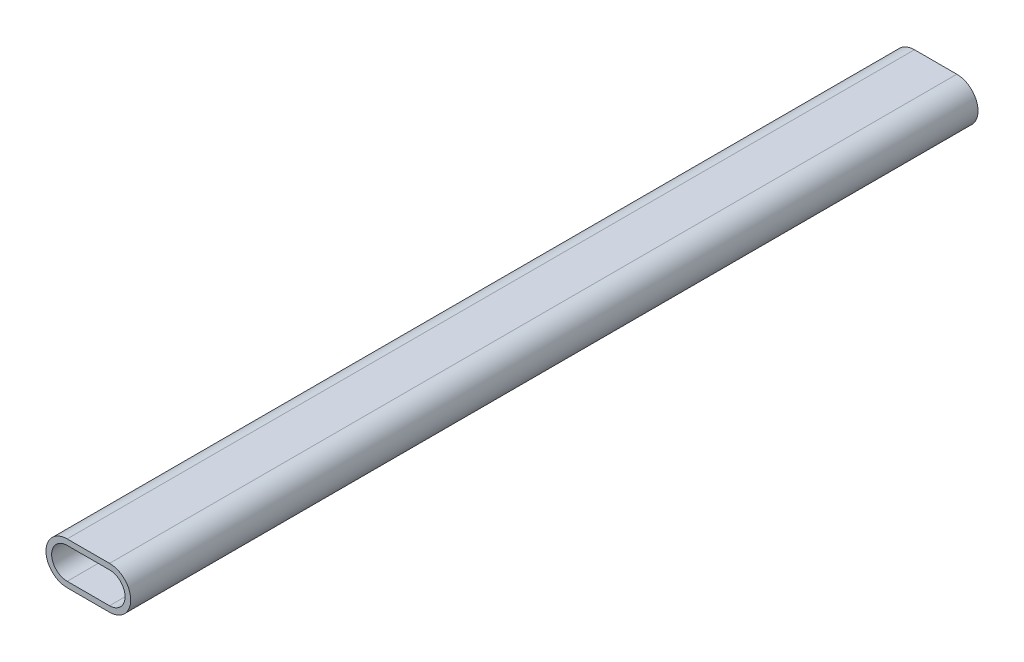
ISO-10303-21;
HEADER;
FILE_DESCRIPTION(('STEP AP214'),'2;1');
FILE_NAME('part.step','',(''),(''),'','','');
FILE_SCHEMA(('AUTOMOTIVE_DESIGN { 1 0 10303 214 1 1 1 1 }'));
ENDSEC;
DATA;
#1=APPLICATION_CONTEXT('core data for automotive mechanical design processes');
#2=APPLICATION_PROTOCOL_DEFINITION('international standard','automotive_design',2000,#1);
#3=PRODUCT_CONTEXT('',#1,'mechanical');
#4=PRODUCT('Part','Part','',(#3));
#5=PRODUCT_RELATED_PRODUCT_CATEGORY('part','',(#4));
#6=PRODUCT_DEFINITION_FORMATION('','',#4);
#7=PRODUCT_DEFINITION_CONTEXT('part definition',#1,'design');
#8=PRODUCT_DEFINITION('design','',#6,#7);
#9=PRODUCT_DEFINITION_SHAPE('','',#8);
#10=(LENGTH_UNIT() NAMED_UNIT(*) SI_UNIT(.MILLI.,.METRE.));
#11=(NAMED_UNIT(*) PLANE_ANGLE_UNIT() SI_UNIT($,.RADIAN.));
#12=(NAMED_UNIT(*) SI_UNIT($,.STERADIAN.) SOLID_ANGLE_UNIT());
#13=UNCERTAINTY_MEASURE_WITH_UNIT(LENGTH_MEASURE(1.E-05),#10,'distance_accuracy_value','');
#14=(GEOMETRIC_REPRESENTATION_CONTEXT(3) GLOBAL_UNCERTAINTY_ASSIGNED_CONTEXT((#13)) GLOBAL_UNIT_ASSIGNED_CONTEXT((#10,
#11,#12)) REPRESENTATION_CONTEXT('',''));
#15=CARTESIAN_POINT('',(0.,0.,0.));
#16=DIRECTION('',(0.,0.,1.));
#17=DIRECTION('',(1.,0.,0.));
#18=AXIS2_PLACEMENT_3D('',#15,#16,#17);
#19=CARTESIAN_POINT('',(-7.5,0.,300.));
#20=DIRECTION('',(0.,0.,1.));
#21=DIRECTION('',(1.,0.,0.));
#22=AXIS2_PLACEMENT_3D('',#19,#20,#21);
#23=PLANE('',#22);
#24=CARTESIAN_POINT('',(-7.5,0.,300.));
#25=DIRECTION('',(0.,0.,1.));
#26=DIRECTION('',(1.,0.,0.));
#27=AXIS2_PLACEMENT_3D('',#24,#25,#26);
#28=CIRCLE('',#27,7.5);
#29=CARTESIAN_POINT('',(-7.5,7.5,300.));
#30=VERTEX_POINT('',#29);
#31=CARTESIAN_POINT('',(-7.5,-7.5,300.));
#32=VERTEX_POINT('',#31);
#33=EDGE_CURVE('E137',#30,#32,#28,.T.);
#34=ORIENTED_EDGE('',*,*,#33,.T.);
#35=DIRECTION('',(1.,0.,0.));
#36=VECTOR('',#35,1.);
#37=CARTESIAN_POINT('',(-7.5,-7.5,300.));
#38=LINE('',#37,#36);
#39=CARTESIAN_POINT('',(7.5,-7.5,300.));
#40=VERTEX_POINT('',#39);
#41=EDGE_CURVE('E140',#32,#40,#38,.T.);
#42=ORIENTED_EDGE('',*,*,#41,.T.);
#43=CARTESIAN_POINT('',(7.5,0.,300.));
#44=DIRECTION('',(0.,0.,1.));
#45=DIRECTION('',(1.,0.,0.));
#46=AXIS2_PLACEMENT_3D('',#43,#44,#45);
#47=CIRCLE('',#46,7.5);
#48=CARTESIAN_POINT('',(7.5,7.5,300.));
#49=VERTEX_POINT('',#48);
#50=EDGE_CURVE('E143',#40,#49,#47,.T.);
#51=ORIENTED_EDGE('',*,*,#50,.T.);
#52=DIRECTION('',(-1.,0.,0.));
#53=VECTOR('',#52,1.);
#54=CARTESIAN_POINT('',(-7.5,7.5,300.));
#55=LINE('',#54,#53);
#56=EDGE_CURVE('E145',#49,#30,#55,.T.);
#57=ORIENTED_EDGE('',*,*,#56,.T.);
#58=EDGE_LOOP('',(#34,#42,#51,#57));
#59=FACE_BOUND('',#58,.T.);
#60=DIRECTION('',(1.,0.,0.));
#61=VECTOR('',#60,1.);
#62=CARTESIAN_POINT('',(-7.5,-5.5,300.));
#63=LINE('',#62,#61);
#64=CARTESIAN_POINT('',(-7.5,-5.5,300.));
#65=VERTEX_POINT('',#64);
#66=CARTESIAN_POINT('',(7.5,-5.5,300.));
#67=VERTEX_POINT('',#66);
#68=EDGE_CURVE('E109',#65,#67,#63,.T.);
#69=ORIENTED_EDGE('',*,*,#68,.F.);
#70=CARTESIAN_POINT('',(-7.5,0.,300.));
#71=DIRECTION('',(0.,0.,1.));
#72=DIRECTION('',(1.,0.,0.));
#73=AXIS2_PLACEMENT_3D('',#70,#71,#72);
#74=CIRCLE('',#73,5.5);
#75=CARTESIAN_POINT('',(-7.5,5.5,300.));
#76=VERTEX_POINT('',#75);
#77=EDGE_CURVE('E101',#76,#65,#74,.T.);
#78=ORIENTED_EDGE('',*,*,#77,.F.);
#79=DIRECTION('',(-1.,0.,0.));
#80=VECTOR('',#79,1.);
#81=CARTESIAN_POINT('',(-7.5,5.5,300.));
#82=LINE('',#81,#80);
#83=CARTESIAN_POINT('',(7.5,5.5,300.));
#84=VERTEX_POINT('',#83);
#85=EDGE_CURVE('E123',#84,#76,#82,.T.);
#86=ORIENTED_EDGE('',*,*,#85,.F.);
#87=CARTESIAN_POINT('',(7.5,0.,300.));
#88=DIRECTION('',(0.,0.,1.));
#89=DIRECTION('',(1.,0.,0.));
#90=AXIS2_PLACEMENT_3D('',#87,#88,#89);
#91=CIRCLE('',#90,5.5);
#92=EDGE_CURVE('E121',#67,#84,#91,.T.);
#93=ORIENTED_EDGE('',*,*,#92,.F.);
#94=EDGE_LOOP('',(#69,#78,#86,#93));
#95=FACE_BOUND('',#94,.T.);
#96=ADVANCED_FACE('F36',(#59,#95),#23,.T.);
#97=CARTESIAN_POINT('',(-7.5,0.,0.));
#98=DIRECTION('',(0.,0.,1.));
#99=DIRECTION('',(1.,0.,0.));
#100=AXIS2_PLACEMENT_3D('',#97,#98,#99);
#101=PLANE('',#100);
#102=CARTESIAN_POINT('',(-7.5,0.,0.));
#103=DIRECTION('',(0.,0.,1.));
#104=DIRECTION('',(1.,0.,0.));
#105=AXIS2_PLACEMENT_3D('',#102,#103,#104);
#106=CIRCLE('',#105,7.5);
#107=CARTESIAN_POINT('',(-7.5,7.5,0.));
#108=VERTEX_POINT('',#107);
#109=CARTESIAN_POINT('',(-7.5,-7.5,0.));
#110=VERTEX_POINT('',#109);
#111=EDGE_CURVE('E117',#108,#110,#106,.T.);
#112=ORIENTED_EDGE('',*,*,#111,.F.);
#113=DIRECTION('',(-1.,0.,0.));
#114=VECTOR('',#113,1.);
#115=CARTESIAN_POINT('',(-7.5,7.5,0.));
#116=LINE('',#115,#114);
#117=CARTESIAN_POINT('',(7.5,7.5,0.));
#118=VERTEX_POINT('',#117);
#119=EDGE_CURVE('E141',#118,#108,#116,.T.);
#120=ORIENTED_EDGE('',*,*,#119,.F.);
#121=CARTESIAN_POINT('',(7.5,0.,0.));
#122=DIRECTION('',(0.,0.,1.));
#123=DIRECTION('',(1.,0.,0.));
#124=AXIS2_PLACEMENT_3D('',#121,#122,#123);
#125=CIRCLE('',#124,7.5);
#126=CARTESIAN_POINT('',(7.5,-7.5,0.));
#127=VERTEX_POINT('',#126);
#128=EDGE_CURVE('E152',#127,#118,#125,.T.);
#129=ORIENTED_EDGE('',*,*,#128,.F.);
#130=DIRECTION('',(1.,0.,0.));
#131=VECTOR('',#130,1.);
#132=CARTESIAN_POINT('',(-7.5,-7.5,0.));
#133=LINE('',#132,#131);
#134=EDGE_CURVE('E150',#110,#127,#133,.T.);
#135=ORIENTED_EDGE('',*,*,#134,.F.);
#136=EDGE_LOOP('',(#112,#120,#129,#135));
#137=FACE_BOUND('',#136,.T.);
#138=CARTESIAN_POINT('',(-7.5,0.,0.));
#139=DIRECTION('',(0.,0.,1.));
#140=DIRECTION('',(1.,0.,0.));
#141=AXIS2_PLACEMENT_3D('',#138,#139,#140);
#142=CIRCLE('',#141,5.5);
#143=CARTESIAN_POINT('',(-7.5,5.5,0.));
#144=VERTEX_POINT('',#143);
#145=CARTESIAN_POINT('',(-7.5,-5.5,0.));
#146=VERTEX_POINT('',#145);
#147=EDGE_CURVE('E59',#144,#146,#142,.T.);
#148=ORIENTED_EDGE('',*,*,#147,.T.);
#149=DIRECTION('',(1.,0.,0.));
#150=VECTOR('',#149,1.);
#151=CARTESIAN_POINT('',(-7.5,-5.5,0.));
#152=LINE('',#151,#150);
#153=CARTESIAN_POINT('',(7.5,-5.5,0.));
#154=VERTEX_POINT('',#153);
#155=EDGE_CURVE('E116',#146,#154,#152,.T.);
#156=ORIENTED_EDGE('',*,*,#155,.T.);
#157=CARTESIAN_POINT('',(7.5,0.,0.));
#158=DIRECTION('',(0.,0.,1.));
#159=DIRECTION('',(1.,0.,0.));
#160=AXIS2_PLACEMENT_3D('',#157,#158,#159);
#161=CIRCLE('',#160,5.5);
#162=CARTESIAN_POINT('',(7.5,5.5,0.));
#163=VERTEX_POINT('',#162);
#164=EDGE_CURVE('E129',#154,#163,#161,.T.);
#165=ORIENTED_EDGE('',*,*,#164,.T.);
#166=DIRECTION('',(-1.,0.,0.));
#167=VECTOR('',#166,1.);
#168=CARTESIAN_POINT('',(-7.5,5.5,0.));
#169=LINE('',#168,#167);
#170=EDGE_CURVE('E110',#163,#144,#169,.T.);
#171=ORIENTED_EDGE('',*,*,#170,.T.);
#172=EDGE_LOOP('',(#148,#156,#165,#171));
#173=FACE_BOUND('',#172,.T.);
#174=ADVANCED_FACE('F170',(#137,#173),#101,.F.);
#175=CARTESIAN_POINT('',(-7.5,0.,300.));
#176=DIRECTION('',(0.,0.,-1.));
#177=DIRECTION('',(-1.,0.,0.));
#178=AXIS2_PLACEMENT_3D('',#175,#176,#177);
#179=CYLINDRICAL_SURFACE('',#178,7.5);
#180=ORIENTED_EDGE('',*,*,#111,.T.);
#181=DIRECTION('',(0.,0.,-1.));
#182=VECTOR('',#181,1.);
#183=CARTESIAN_POINT('',(-7.5,-7.5,300.));
#184=LINE('',#183,#182);
#185=EDGE_CURVE('E11',#32,#110,#184,.T.);
#186=ORIENTED_EDGE('',*,*,#185,.F.);
#187=ORIENTED_EDGE('',*,*,#33,.F.);
#188=DIRECTION('',(0.,0.,-1.));
#189=VECTOR('',#188,1.);
#190=CARTESIAN_POINT('',(-7.5,7.5,300.));
#191=LINE('',#190,#189);
#192=EDGE_CURVE('E147',#30,#108,#191,.T.);
#193=ORIENTED_EDGE('',*,*,#192,.T.);
#194=EDGE_LOOP('',(#180,#186,#187,#193));
#195=FACE_BOUND('',#194,.T.);
#196=ADVANCED_FACE('F38',(#195),#179,.T.);
#197=CARTESIAN_POINT('',(-7.5,-7.5,300.));
#198=DIRECTION('',(0.,1.,0.));
#199=DIRECTION('',(0.,0.,1.));
#200=AXIS2_PLACEMENT_3D('',#197,#198,#199);
#201=PLANE('',#200);
#202=ORIENTED_EDGE('',*,*,#134,.T.);
#203=DIRECTION('',(0.,0.,-1.));
#204=VECTOR('',#203,1.);
#205=CARTESIAN_POINT('',(7.5,-7.5,300.));
#206=LINE('',#205,#204);
#207=EDGE_CURVE('E44',#40,#127,#206,.T.);
#208=ORIENTED_EDGE('',*,*,#207,.F.);
#209=ORIENTED_EDGE('',*,*,#41,.F.);
#210=ORIENTED_EDGE('',*,*,#185,.T.);
#211=EDGE_LOOP('',(#202,#208,#209,#210));
#212=FACE_BOUND('',#211,.T.);
#213=ADVANCED_FACE('F180',(#212),#201,.F.);
#214=CARTESIAN_POINT('',(7.5,0.,300.));
#215=DIRECTION('',(0.,0.,-1.));
#216=DIRECTION('',(-1.,0.,0.));
#217=AXIS2_PLACEMENT_3D('',#214,#215,#216);
#218=CYLINDRICAL_SURFACE('',#217,7.5);
#219=ORIENTED_EDGE('',*,*,#128,.T.);
#220=DIRECTION('',(0.,0.,-1.));
#221=VECTOR('',#220,1.);
#222=CARTESIAN_POINT('',(7.5,7.5,300.));
#223=LINE('',#222,#221);
#224=EDGE_CURVE('E157',#49,#118,#223,.T.);
#225=ORIENTED_EDGE('',*,*,#224,.F.);
#226=ORIENTED_EDGE('',*,*,#50,.F.);
#227=ORIENTED_EDGE('',*,*,#207,.T.);
#228=EDGE_LOOP('',(#219,#225,#226,#227));
#229=FACE_BOUND('',#228,.T.);
#230=ADVANCED_FACE('F164',(#229),#218,.T.);
#231=CARTESIAN_POINT('',(-7.5,7.5,300.));
#232=DIRECTION('',(0.,-1.,0.));
#233=DIRECTION('',(0.,0.,-1.));
#234=AXIS2_PLACEMENT_3D('',#231,#232,#233);
#235=PLANE('',#234);
#236=ORIENTED_EDGE('',*,*,#119,.T.);
#237=ORIENTED_EDGE('',*,*,#192,.F.);
#238=ORIENTED_EDGE('',*,*,#56,.F.);
#239=ORIENTED_EDGE('',*,*,#224,.T.);
#240=EDGE_LOOP('',(#236,#237,#238,#239));
#241=FACE_BOUND('',#240,.T.);
#242=ADVANCED_FACE('F174',(#241),#235,.F.);
#243=CARTESIAN_POINT('',(-7.5,0.,300.));
#244=DIRECTION('',(0.,0.,-1.));
#245=DIRECTION('',(-1.,0.,0.));
#246=AXIS2_PLACEMENT_3D('',#243,#244,#245);
#247=CYLINDRICAL_SURFACE('',#246,5.5);
#248=ORIENTED_EDGE('',*,*,#147,.F.);
#249=DIRECTION('',(0.,0.,-1.));
#250=VECTOR('',#249,1.);
#251=CARTESIAN_POINT('',(-7.5,5.5,300.));
#252=LINE('',#251,#250);
#253=EDGE_CURVE('E105',#76,#144,#252,.T.);
#254=ORIENTED_EDGE('',*,*,#253,.F.);
#255=ORIENTED_EDGE('',*,*,#77,.T.);
#256=DIRECTION('',(0.,0.,-1.));
#257=VECTOR('',#256,1.);
#258=CARTESIAN_POINT('',(-7.5,-5.5,300.));
#259=LINE('',#258,#257);
#260=EDGE_CURVE('E104',#65,#146,#259,.T.);
#261=ORIENTED_EDGE('',*,*,#260,.T.);
#262=EDGE_LOOP('',(#248,#254,#255,#261));
#263=FACE_BOUND('',#262,.T.);
#264=ADVANCED_FACE('F103',(#263),#247,.F.);
#265=CARTESIAN_POINT('',(-7.5,-5.5,300.));
#266=DIRECTION('',(0.,1.,0.));
#267=DIRECTION('',(0.,0.,1.));
#268=AXIS2_PLACEMENT_3D('',#265,#266,#267);
#269=PLANE('',#268);
#270=ORIENTED_EDGE('',*,*,#155,.F.);
#271=ORIENTED_EDGE('',*,*,#260,.F.);
#272=ORIENTED_EDGE('',*,*,#68,.T.);
#273=DIRECTION('',(0.,0.,-1.));
#274=VECTOR('',#273,1.);
#275=CARTESIAN_POINT('',(7.5,-5.5,300.));
#276=LINE('',#275,#274);
#277=EDGE_CURVE('E118',#67,#154,#276,.T.);
#278=ORIENTED_EDGE('',*,*,#277,.T.);
#279=EDGE_LOOP('',(#270,#271,#272,#278));
#280=FACE_BOUND('',#279,.T.);
#281=ADVANCED_FACE('F113',(#280),#269,.T.);
#282=CARTESIAN_POINT('',(7.5,0.,300.));
#283=DIRECTION('',(0.,0.,-1.));
#284=DIRECTION('',(-1.,0.,0.));
#285=AXIS2_PLACEMENT_3D('',#282,#283,#284);
#286=CYLINDRICAL_SURFACE('',#285,5.5);
#287=ORIENTED_EDGE('',*,*,#164,.F.);
#288=ORIENTED_EDGE('',*,*,#277,.F.);
#289=ORIENTED_EDGE('',*,*,#92,.T.);
#290=DIRECTION('',(0.,0.,-1.));
#291=VECTOR('',#290,1.);
#292=CARTESIAN_POINT('',(7.5,5.5,300.));
#293=LINE('',#292,#291);
#294=EDGE_CURVE('E51',#84,#163,#293,.T.);
#295=ORIENTED_EDGE('',*,*,#294,.T.);
#296=EDGE_LOOP('',(#287,#288,#289,#295));
#297=FACE_BOUND('',#296,.T.);
#298=ADVANCED_FACE('F203',(#297),#286,.F.);
#299=CARTESIAN_POINT('',(-7.5,5.5,300.));
#300=DIRECTION('',(0.,-1.,0.));
#301=DIRECTION('',(0.,0.,-1.));
#302=AXIS2_PLACEMENT_3D('',#299,#300,#301);
#303=PLANE('',#302);
#304=ORIENTED_EDGE('',*,*,#170,.F.);
#305=ORIENTED_EDGE('',*,*,#294,.F.);
#306=ORIENTED_EDGE('',*,*,#85,.T.);
#307=ORIENTED_EDGE('',*,*,#253,.T.);
#308=EDGE_LOOP('',(#304,#305,#306,#307));
#309=FACE_BOUND('',#308,.T.);
#310=ADVANCED_FACE('F207',(#309),#303,.T.);
#311=CLOSED_SHELL('',(#96,#174,#196,#213,#230,#242,#264,#281,#298,#310));
#312=MANIFOLD_SOLID_BREP('B2',#311);
#313=ADVANCED_BREP_SHAPE_REPRESENTATION('',(#18,#312),#14);
#314=SHAPE_DEFINITION_REPRESENTATION(#9,#313);
ENDSEC;
END-ISO-10303-21;
